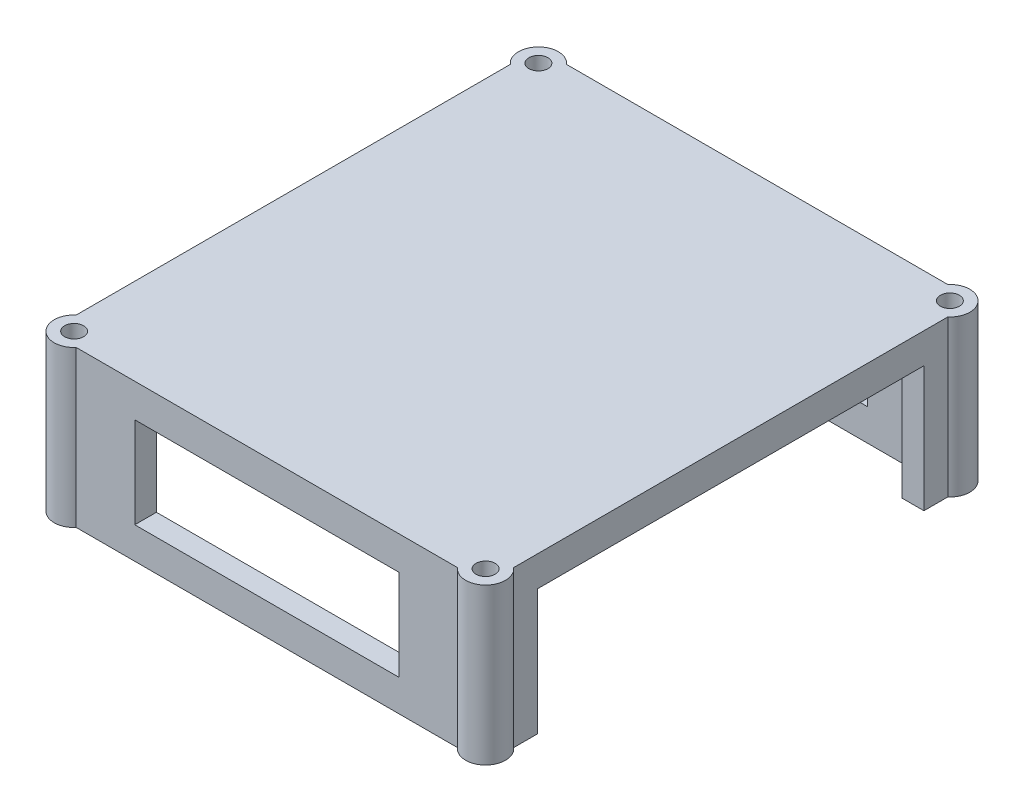
ISO-10303-21;
HEADER;
FILE_DESCRIPTION(('STEP AP214'),'2;1');
FILE_NAME('part.step','',(''),(''),'','','');
FILE_SCHEMA(('AUTOMOTIVE_DESIGN { 1 0 10303 214 1 1 1 1 }'));
ENDSEC;
DATA;
#1=APPLICATION_CONTEXT('core data for automotive mechanical design processes');
#2=APPLICATION_PROTOCOL_DEFINITION('international standard','automotive_design',2000,#1);
#3=PRODUCT_CONTEXT('',#1,'mechanical');
#4=PRODUCT('Part','Part','',(#3));
#5=PRODUCT_RELATED_PRODUCT_CATEGORY('part','',(#4));
#6=PRODUCT_DEFINITION_FORMATION('','',#4);
#7=PRODUCT_DEFINITION_CONTEXT('part definition',#1,'design');
#8=PRODUCT_DEFINITION('design','',#6,#7);
#9=PRODUCT_DEFINITION_SHAPE('','',#8);
#10=(LENGTH_UNIT() NAMED_UNIT(*) SI_UNIT(.MILLI.,.METRE.));
#11=(NAMED_UNIT(*) PLANE_ANGLE_UNIT() SI_UNIT($,.RADIAN.));
#12=(NAMED_UNIT(*) SI_UNIT($,.STERADIAN.) SOLID_ANGLE_UNIT());
#13=UNCERTAINTY_MEASURE_WITH_UNIT(LENGTH_MEASURE(1.E-05),#10,'distance_accuracy_value','');
#14=(GEOMETRIC_REPRESENTATION_CONTEXT(3) GLOBAL_UNCERTAINTY_ASSIGNED_CONTEXT((#13)) GLOBAL_UNIT_ASSIGNED_CONTEXT((#10,
#11,#12)) REPRESENTATION_CONTEXT('',''));
#15=CARTESIAN_POINT('',(0.,0.,0.));
#16=DIRECTION('',(0.,0.,1.));
#17=DIRECTION('',(1.,0.,0.));
#18=AXIS2_PLACEMENT_3D('',#15,#16,#17);
#19=CARTESIAN_POINT('',(0.,0.,0.));
#20=DIRECTION('',(0.,-1.,0.));
#21=DIRECTION('',(0.,0.,-1.));
#22=AXIS2_PLACEMENT_3D('',#19,#20,#21);
#23=PLANE('',#22);
#24=DIRECTION('',(-1.,0.,0.));
#25=VECTOR('',#24,1.);
#26=CARTESIAN_POINT('',(0.,0.,-143.764));
#27=LINE('',#26,#25);
#28=CARTESIAN_POINT('',(120.031358673363,0.,-143.764));
#29=VERTEX_POINT('',#28);
#30=CARTESIAN_POINT('',(8.23864132663731,0.,-143.764));
#31=VERTEX_POINT('',#30);
#32=EDGE_CURVE('E243',#29,#31,#27,.T.);
#33=ORIENTED_EDGE('',*,*,#32,.F.);
#34=CARTESIAN_POINT('',(124.46,0.,-139.954));
#35=DIRECTION('',(0.,-1.,0.));
#36=DIRECTION('',(0.,0.,-1.));
#37=AXIS2_PLACEMENT_3D('',#34,#35,#36);
#38=CIRCLE('',#37,5.84200000000003);
#39=CARTESIAN_POINT('',(128.27,0.,-135.525358673363));
#40=VERTEX_POINT('',#39);
#41=EDGE_CURVE('E246',#29,#40,#38,.T.);
#42=ORIENTED_EDGE('',*,*,#41,.T.);
#43=DIRECTION('',(0.,0.,-1.));
#44=VECTOR('',#43,1.);
#45=CARTESIAN_POINT('',(128.27,0.,0.));
#46=LINE('',#45,#44);
#47=CARTESIAN_POINT('',(128.27,0.,-128.524));
#48=VERTEX_POINT('',#47);
#49=EDGE_CURVE('E47',#48,#40,#46,.T.);
#50=ORIENTED_EDGE('',*,*,#49,.F.);
#51=DIRECTION('',(-1.,0.,0.));
#52=VECTOR('',#51,1.);
#53=CARTESIAN_POINT('',(0.,0.,-128.524));
#54=LINE('',#53,#52);
#55=CARTESIAN_POINT('',(121.92,0.,-128.524));
#56=VERTEX_POINT('',#55);
#57=EDGE_CURVE('E361',#48,#56,#54,.T.);
#58=ORIENTED_EDGE('',*,*,#57,.T.);
#59=DIRECTION('',(0.,0.,1.));
#60=VECTOR('',#59,1.);
#61=CARTESIAN_POINT('',(121.92,0.,-6.35));
#62=LINE('',#61,#60);
#63=CARTESIAN_POINT('',(121.92,0.,-134.693071944989));
#64=VERTEX_POINT('',#63);
#65=EDGE_CURVE('E447',#64,#56,#62,.T.);
#66=ORIENTED_EDGE('',*,*,#65,.F.);
#67=CARTESIAN_POINT('',(119.199071944989,0.,-137.414));
#68=VERTEX_POINT('',#67);
#69=EDGE_CURVE('E263',#64,#68,#38,.T.);
#70=ORIENTED_EDGE('',*,*,#69,.T.);
#71=DIRECTION('',(1.,0.,0.));
#72=VECTOR('',#71,1.);
#73=CARTESIAN_POINT('',(6.35000000000002,0.,-137.414));
#74=LINE('',#73,#72);
#75=CARTESIAN_POINT('',(9.07092805501082,0.,-137.414));
#76=VERTEX_POINT('',#75);
#77=EDGE_CURVE('E444',#76,#68,#74,.T.);
#78=ORIENTED_EDGE('',*,*,#77,.F.);
#79=CARTESIAN_POINT('',(3.81,0.,-139.954));
#80=DIRECTION('',(0.,-1.,0.));
#81=DIRECTION('',(0.,0.,-1.));
#82=AXIS2_PLACEMENT_3D('',#79,#80,#81);
#83=CIRCLE('',#82,5.84199999999999);
#84=CARTESIAN_POINT('',(6.35000000000002,0.,-134.693071944989));
#85=VERTEX_POINT('',#84);
#86=EDGE_CURVE('E278',#76,#85,#83,.T.);
#87=ORIENTED_EDGE('',*,*,#86,.T.);
#88=DIRECTION('',(0.,0.,-1.));
#89=VECTOR('',#88,1.);
#90=CARTESIAN_POINT('',(6.35,0.,-6.35));
#91=LINE('',#90,#89);
#92=CARTESIAN_POINT('',(6.35000000000001,0.,-128.524));
#93=VERTEX_POINT('',#92);
#94=EDGE_CURVE('E431',#93,#85,#91,.T.);
#95=ORIENTED_EDGE('',*,*,#94,.F.);
#96=CARTESIAN_POINT('',(0.,0.,-128.524));
#97=VERTEX_POINT('',#96);
#98=EDGE_CURVE('E365',#93,#97,#54,.T.);
#99=ORIENTED_EDGE('',*,*,#98,.T.);
#100=DIRECTION('',(0.,0.,1.));
#101=VECTOR('',#100,1.);
#102=CARTESIAN_POINT('',(0.,0.,0.));
#103=LINE('',#102,#101);
#104=CARTESIAN_POINT('',(0.,0.,-135.525358673363));
#105=VERTEX_POINT('',#104);
#106=EDGE_CURVE('E459',#105,#97,#103,.T.);
#107=ORIENTED_EDGE('',*,*,#106,.F.);
#108=EDGE_CURVE('E249',#105,#31,#83,.T.);
#109=ORIENTED_EDGE('',*,*,#108,.T.);
#110=EDGE_LOOP('',(#33,#42,#50,#58,#66,#70,#78,#87,#95,#99,#107,#109));
#111=FACE_BOUND('',#110,.T.);
#112=CARTESIAN_POINT('',(3.81,0.,-139.954));
#113=DIRECTION('',(0.,-1.,0.));
#114=DIRECTION('',(0.,0.,-1.));
#115=AXIS2_PLACEMENT_3D('',#112,#113,#114);
#116=CIRCLE('',#115,2.794);
#117=CARTESIAN_POINT('',(3.81,0.,-142.748));
#118=VERTEX_POINT('',#117);
#119=EDGE_CURVE('E327',#118,#118,#116,.T.);
#120=ORIENTED_EDGE('',*,*,#119,.F.);
#121=EDGE_LOOP('',(#120));
#122=FACE_BOUND('',#121,.T.);
#123=CARTESIAN_POINT('',(124.46,0.,-139.954));
#124=DIRECTION('',(0.,-1.,0.));
#125=DIRECTION('',(0.,0.,-1.));
#126=AXIS2_PLACEMENT_3D('',#123,#124,#125);
#127=CIRCLE('',#126,2.79400000000001);
#128=CARTESIAN_POINT('',(124.46,0.,-142.748));
#129=VERTEX_POINT('',#128);
#130=EDGE_CURVE('E323',#129,#129,#127,.T.);
#131=ORIENTED_EDGE('',*,*,#130,.F.);
#132=EDGE_LOOP('',(#131));
#133=FACE_BOUND('',#132,.T.);
#134=ADVANCED_FACE('F32',(#111,#122,#133),#23,.T.);
#135=CARTESIAN_POINT('',(0.,45.72,0.));
#136=DIRECTION('',(1.,0.,0.));
#137=DIRECTION('',(0.,0.,-1.));
#138=AXIS2_PLACEMENT_3D('',#135,#136,#137);
#139=PLANE('',#138);
#140=DIRECTION('',(0.,0.,1.));
#141=VECTOR('',#140,1.);
#142=CARTESIAN_POINT('',(0.,45.72,0.));
#143=LINE('',#142,#141);
#144=CARTESIAN_POINT('',(0.,45.72,-135.525358673363));
#145=VERTEX_POINT('',#144);
#146=CARTESIAN_POINT('',(0.,45.72,-8.23864132663733));
#147=VERTEX_POINT('',#146);
#148=EDGE_CURVE('E251',#145,#147,#143,.T.);
#149=ORIENTED_EDGE('',*,*,#148,.F.);
#150=DIRECTION('',(0.,-1.,0.));
#151=VECTOR('',#150,1.);
#152=CARTESIAN_POINT('',(0.,45.72,-135.525358673363));
#153=LINE('',#152,#151);
#154=EDGE_CURVE('E286',#145,#105,#153,.T.);
#155=ORIENTED_EDGE('',*,*,#154,.T.);
#156=ORIENTED_EDGE('',*,*,#106,.T.);
#157=DIRECTION('',(0.,-1.,0.));
#158=VECTOR('',#157,1.);
#159=CARTESIAN_POINT('',(0.,45.72,-128.524));
#160=LINE('',#159,#158);
#161=CARTESIAN_POINT('',(0.,36.83,-128.524));
#162=VERTEX_POINT('',#161);
#163=EDGE_CURVE('E367',#162,#97,#160,.T.);
#164=ORIENTED_EDGE('',*,*,#163,.F.);
#165=DIRECTION('',(0.,0.,-1.));
#166=VECTOR('',#165,1.);
#167=CARTESIAN_POINT('',(0.,36.83,0.));
#168=LINE('',#167,#166);
#169=CARTESIAN_POINT('',(0.,36.83,-15.24));
#170=VERTEX_POINT('',#169);
#171=EDGE_CURVE('E372',#170,#162,#168,.T.);
#172=ORIENTED_EDGE('',*,*,#171,.F.);
#173=DIRECTION('',(0.,-1.,0.));
#174=VECTOR('',#173,1.);
#175=CARTESIAN_POINT('',(0.,45.72,-15.24));
#176=LINE('',#175,#174);
#177=CARTESIAN_POINT('',(0.,0.,-15.24));
#178=VERTEX_POINT('',#177);
#179=EDGE_CURVE('E380',#170,#178,#176,.T.);
#180=ORIENTED_EDGE('',*,*,#179,.T.);
#181=CARTESIAN_POINT('',(0.,0.,-8.23864132663733));
#182=VERTEX_POINT('',#181);
#183=EDGE_CURVE('E441',#178,#182,#103,.T.);
#184=ORIENTED_EDGE('',*,*,#183,.T.);
#185=DIRECTION('',(0.,-1.,0.));
#186=VECTOR('',#185,1.);
#187=CARTESIAN_POINT('',(0.,45.72,-8.23864132663733));
#188=LINE('',#187,#186);
#189=EDGE_CURVE('E320',#182,#147,#188,.F.);
#190=ORIENTED_EDGE('',*,*,#189,.T.);
#191=EDGE_LOOP('',(#149,#155,#156,#164,#172,#180,#184,#190));
#192=FACE_BOUND('',#191,.T.);
#193=ADVANCED_FACE('F34',(#192),#139,.F.);
#194=CARTESIAN_POINT('',(0.,45.72,0.));
#195=DIRECTION('',(0.,0.,-1.));
#196=DIRECTION('',(-1.,0.,0.));
#197=AXIS2_PLACEMENT_3D('',#194,#195,#196);
#198=PLANE('',#197);
#199=DIRECTION('',(1.,0.,0.));
#200=VECTOR('',#199,1.);
#201=CARTESIAN_POINT('',(0.,35.941,0.));
#202=LINE('',#201,#200);
#203=CARTESIAN_POINT('',(25.4,35.941,0.));
#204=VERTEX_POINT('',#203);
#205=CARTESIAN_POINT('',(102.87,35.941,0.));
#206=VERTEX_POINT('',#205);
#207=EDGE_CURVE('E422',#204,#206,#202,.T.);
#208=ORIENTED_EDGE('',*,*,#207,.T.);
#209=DIRECTION('',(0.,-1.,0.));
#210=VECTOR('',#209,1.);
#211=CARTESIAN_POINT('',(102.87,45.72,0.));
#212=LINE('',#211,#210);
#213=CARTESIAN_POINT('',(102.87,9.271,0.));
#214=VERTEX_POINT('',#213);
#215=EDGE_CURVE('E428',#206,#214,#212,.T.);
#216=ORIENTED_EDGE('',*,*,#215,.T.);
#217=DIRECTION('',(-1.,0.,0.));
#218=VECTOR('',#217,1.);
#219=CARTESIAN_POINT('',(0.,9.271,0.));
#220=LINE('',#219,#218);
#221=CARTESIAN_POINT('',(25.4,9.271,0.));
#222=VERTEX_POINT('',#221);
#223=EDGE_CURVE('E410',#214,#222,#220,.T.);
#224=ORIENTED_EDGE('',*,*,#223,.T.);
#225=DIRECTION('',(0.,1.,0.));
#226=VECTOR('',#225,1.);
#227=CARTESIAN_POINT('',(25.4,45.72,0.));
#228=LINE('',#227,#226);
#229=EDGE_CURVE('E416',#222,#204,#228,.T.);
#230=ORIENTED_EDGE('',*,*,#229,.T.);
#231=EDGE_LOOP('',(#208,#216,#224,#230));
#232=FACE_BOUND('',#231,.T.);
#233=DIRECTION('',(1.,0.,0.));
#234=VECTOR('',#233,1.);
#235=CARTESIAN_POINT('',(0.,0.,0.));
#236=LINE('',#235,#234);
#237=CARTESIAN_POINT('',(8.23864132663733,0.,0.));
#238=VERTEX_POINT('',#237);
#239=CARTESIAN_POINT('',(120.031358673363,0.,0.));
#240=VERTEX_POINT('',#239);
#241=EDGE_CURVE('E461',#238,#240,#236,.T.);
#242=ORIENTED_EDGE('',*,*,#241,.T.);
#243=DIRECTION('',(0.,-1.,0.));
#244=VECTOR('',#243,1.);
#245=CARTESIAN_POINT('',(120.031358673363,45.72,0.));
#246=LINE('',#245,#244);
#247=CARTESIAN_POINT('',(120.031358673363,45.72,0.));
#248=VERTEX_POINT('',#247);
#249=EDGE_CURVE('E303',#240,#248,#246,.F.);
#250=ORIENTED_EDGE('',*,*,#249,.T.);
#251=DIRECTION('',(1.,0.,0.));
#252=VECTOR('',#251,1.);
#253=CARTESIAN_POINT('',(0.,45.72,0.));
#254=LINE('',#253,#252);
#255=CARTESIAN_POINT('',(8.23864132663733,45.72,0.));
#256=VERTEX_POINT('',#255);
#257=EDGE_CURVE('E451',#256,#248,#254,.T.);
#258=ORIENTED_EDGE('',*,*,#257,.F.);
#259=DIRECTION('',(0.,-1.,0.));
#260=VECTOR('',#259,1.);
#261=CARTESIAN_POINT('',(8.23864132663733,45.72,0.));
#262=LINE('',#261,#260);
#263=EDGE_CURVE('E317',#256,#238,#262,.T.);
#264=ORIENTED_EDGE('',*,*,#263,.T.);
#265=EDGE_LOOP('',(#242,#250,#258,#264));
#266=FACE_BOUND('',#265,.T.);
#267=ADVANCED_FACE('F584',(#232,#266),#198,.F.);
#268=CARTESIAN_POINT('',(128.27,45.72,0.));
#269=DIRECTION('',(-1.,0.,0.));
#270=DIRECTION('',(0.,0.,1.));
#271=AXIS2_PLACEMENT_3D('',#268,#269,#270);
#272=PLANE('',#271);
#273=ORIENTED_EDGE('',*,*,#49,.T.);
#274=DIRECTION('',(0.,-1.,0.));
#275=VECTOR('',#274,1.);
#276=CARTESIAN_POINT('',(128.27,45.72,-135.525358673363));
#277=LINE('',#276,#275);
#278=CARTESIAN_POINT('',(128.27,45.72,-135.525358673363));
#279=VERTEX_POINT('',#278);
#280=EDGE_CURVE('E259',#40,#279,#277,.F.);
#281=ORIENTED_EDGE('',*,*,#280,.T.);
#282=DIRECTION('',(0.,0.,-1.));
#283=VECTOR('',#282,1.);
#284=CARTESIAN_POINT('',(128.27,45.72,0.));
#285=LINE('',#284,#283);
#286=CARTESIAN_POINT('',(128.27,45.72,-8.23864132663734));
#287=VERTEX_POINT('',#286);
#288=EDGE_CURVE('E454',#287,#279,#285,.T.);
#289=ORIENTED_EDGE('',*,*,#288,.F.);
#290=DIRECTION('',(0.,-1.,0.));
#291=VECTOR('',#290,1.);
#292=CARTESIAN_POINT('',(128.27,45.72,-8.23864132663734));
#293=LINE('',#292,#291);
#294=CARTESIAN_POINT('',(128.27,0.,-8.23864132663734));
#295=VERTEX_POINT('',#294);
#296=EDGE_CURVE('E300',#287,#295,#293,.T.);
#297=ORIENTED_EDGE('',*,*,#296,.T.);
#298=CARTESIAN_POINT('',(128.27,0.,-15.24));
#299=VERTEX_POINT('',#298);
#300=EDGE_CURVE('E252',#295,#299,#46,.T.);
#301=ORIENTED_EDGE('',*,*,#300,.T.);
#302=DIRECTION('',(0.,-1.,0.));
#303=VECTOR('',#302,1.);
#304=CARTESIAN_POINT('',(128.27,36.83,-15.24));
#305=LINE('',#304,#303);
#306=CARTESIAN_POINT('',(128.27,36.83,-15.24));
#307=VERTEX_POINT('',#306);
#308=EDGE_CURVE('E352',#307,#299,#305,.T.);
#309=ORIENTED_EDGE('',*,*,#308,.F.);
#310=DIRECTION('',(0.,0.,-1.));
#311=VECTOR('',#310,1.);
#312=CARTESIAN_POINT('',(128.27,36.83,-15.24));
#313=LINE('',#312,#311);
#314=CARTESIAN_POINT('',(128.27,36.83,-128.524));
#315=VERTEX_POINT('',#314);
#316=EDGE_CURVE('E349',#307,#315,#313,.T.);
#317=ORIENTED_EDGE('',*,*,#316,.T.);
#318=DIRECTION('',(0.,-1.,0.));
#319=VECTOR('',#318,1.);
#320=CARTESIAN_POINT('',(128.27,36.83,-128.524));
#321=LINE('',#320,#319);
#322=EDGE_CURVE('E345',#315,#48,#321,.T.);
#323=ORIENTED_EDGE('',*,*,#322,.T.);
#324=EDGE_LOOP('',(#273,#281,#289,#297,#301,#309,#317,#323));
#325=FACE_BOUND('',#324,.T.);
#326=ADVANCED_FACE('F598',(#325),#272,.F.);
#327=CARTESIAN_POINT('',(0.,45.72,-143.764));
#328=DIRECTION('',(0.,0.,1.));
#329=DIRECTION('',(1.,0.,0.));
#330=AXIS2_PLACEMENT_3D('',#327,#328,#329);
#331=PLANE('',#330);
#332=DIRECTION('',(-1.,0.,0.));
#333=VECTOR('',#332,1.);
#334=CARTESIAN_POINT('',(102.87,9.271,-143.764));
#335=LINE('',#334,#333);
#336=CARTESIAN_POINT('',(102.87,9.271,-143.764));
#337=VERTEX_POINT('',#336);
#338=CARTESIAN_POINT('',(25.4,9.271,-143.764));
#339=VERTEX_POINT('',#338);
#340=EDGE_CURVE('E385',#337,#339,#335,.T.);
#341=ORIENTED_EDGE('',*,*,#340,.F.);
#342=DIRECTION('',(0.,-1.,0.));
#343=VECTOR('',#342,1.);
#344=CARTESIAN_POINT('',(102.87,35.941,-143.764));
#345=LINE('',#344,#343);
#346=CARTESIAN_POINT('',(102.87,35.941,-143.764));
#347=VERTEX_POINT('',#346);
#348=EDGE_CURVE('E383',#347,#337,#345,.T.);
#349=ORIENTED_EDGE('',*,*,#348,.F.);
#350=DIRECTION('',(1.,0.,0.));
#351=VECTOR('',#350,1.);
#352=CARTESIAN_POINT('',(102.87,35.941,-143.764));
#353=LINE('',#352,#351);
#354=CARTESIAN_POINT('',(25.4,35.941,-143.764));
#355=VERTEX_POINT('',#354);
#356=EDGE_CURVE('E391',#355,#347,#353,.T.);
#357=ORIENTED_EDGE('',*,*,#356,.F.);
#358=DIRECTION('',(0.,1.,0.));
#359=VECTOR('',#358,1.);
#360=CARTESIAN_POINT('',(25.4,35.941,-143.764));
#361=LINE('',#360,#359);
#362=EDGE_CURVE('E388',#339,#355,#361,.T.);
#363=ORIENTED_EDGE('',*,*,#362,.F.);
#364=EDGE_LOOP('',(#341,#349,#357,#363));
#365=FACE_BOUND('',#364,.T.);
#366=DIRECTION('',(-1.,0.,0.));
#367=VECTOR('',#366,1.);
#368=CARTESIAN_POINT('',(0.,45.72,-143.764));
#369=LINE('',#368,#367);
#370=CARTESIAN_POINT('',(120.031358673363,45.72,-143.764));
#371=VERTEX_POINT('',#370);
#372=CARTESIAN_POINT('',(8.23864132663731,45.72,-143.764));
#373=VERTEX_POINT('',#372);
#374=EDGE_CURVE('E55',#371,#373,#369,.T.);
#375=ORIENTED_EDGE('',*,*,#374,.F.);
#376=DIRECTION('',(0.,-1.,0.));
#377=VECTOR('',#376,1.);
#378=CARTESIAN_POINT('',(120.031358673363,45.72,-143.764));
#379=LINE('',#378,#377);
#380=EDGE_CURVE('E254',#371,#29,#379,.T.);
#381=ORIENTED_EDGE('',*,*,#380,.T.);
#382=ORIENTED_EDGE('',*,*,#32,.T.);
#383=DIRECTION('',(0.,-1.,0.));
#384=VECTOR('',#383,1.);
#385=CARTESIAN_POINT('',(8.23864132663731,45.72,-143.764));
#386=LINE('',#385,#384);
#387=EDGE_CURVE('E284',#31,#373,#386,.F.);
#388=ORIENTED_EDGE('',*,*,#387,.T.);
#389=EDGE_LOOP('',(#375,#381,#382,#388));
#390=FACE_BOUND('',#389,.T.);
#391=ADVANCED_FACE('F255',(#365,#390),#331,.F.);
#392=CARTESIAN_POINT('',(0.,45.72,0.));
#393=DIRECTION('',(0.,-1.,0.));
#394=DIRECTION('',(0.,0.,-1.));
#395=AXIS2_PLACEMENT_3D('',#392,#393,#394);
#396=PLANE('',#395);
#397=ORIENTED_EDGE('',*,*,#288,.T.);
#398=CARTESIAN_POINT('',(124.46,45.72,-139.954));
#399=DIRECTION('',(0.,-1.,0.));
#400=DIRECTION('',(0.,0.,-1.));
#401=AXIS2_PLACEMENT_3D('',#398,#399,#400);
#402=CIRCLE('',#401,5.84200000000003);
#403=EDGE_CURVE('E266',#371,#279,#402,.T.);
#404=ORIENTED_EDGE('',*,*,#403,.F.);
#405=ORIENTED_EDGE('',*,*,#374,.T.);
#406=CARTESIAN_POINT('',(3.81,45.72,-139.954));
#407=DIRECTION('',(0.,-1.,0.));
#408=DIRECTION('',(0.,0.,-1.));
#409=AXIS2_PLACEMENT_3D('',#406,#407,#408);
#410=CIRCLE('',#409,5.84199999999999);
#411=EDGE_CURVE('E274',#145,#373,#410,.T.);
#412=ORIENTED_EDGE('',*,*,#411,.F.);
#413=ORIENTED_EDGE('',*,*,#148,.T.);
#414=CARTESIAN_POINT('',(3.81,45.72,-3.81));
#415=DIRECTION('',(0.,-1.,0.));
#416=DIRECTION('',(0.,0.,-1.));
#417=AXIS2_PLACEMENT_3D('',#414,#415,#416);
#418=CIRCLE('',#417,5.842);
#419=EDGE_CURVE('E306',#256,#147,#418,.T.);
#420=ORIENTED_EDGE('',*,*,#419,.F.);
#421=ORIENTED_EDGE('',*,*,#257,.T.);
#422=CARTESIAN_POINT('',(124.46,45.72,-3.81));
#423=DIRECTION('',(0.,-1.,0.));
#424=DIRECTION('',(0.,0.,-1.));
#425=AXIS2_PLACEMENT_3D('',#422,#423,#424);
#426=CIRCLE('',#425,5.84200000000001);
#427=EDGE_CURVE('E289',#287,#248,#426,.T.);
#428=ORIENTED_EDGE('',*,*,#427,.F.);
#429=EDGE_LOOP('',(#397,#404,#405,#412,#413,#420,#421,#428));
#430=FACE_BOUND('',#429,.T.);
#431=CARTESIAN_POINT('',(3.81,45.72,-3.81));
#432=DIRECTION('',(0.,-1.,0.));
#433=DIRECTION('',(0.,0.,-1.));
#434=AXIS2_PLACEMENT_3D('',#431,#432,#433);
#435=CIRCLE('',#434,2.794);
#436=CARTESIAN_POINT('',(3.81,45.72,-6.604));
#437=VERTEX_POINT('',#436);
#438=EDGE_CURVE('E342',#437,#437,#435,.T.);
#439=ORIENTED_EDGE('',*,*,#438,.T.);
#440=EDGE_LOOP('',(#439));
#441=FACE_BOUND('',#440,.T.);
#442=CARTESIAN_POINT('',(124.46,45.72,-3.81));
#443=DIRECTION('',(0.,-1.,0.));
#444=DIRECTION('',(0.,0.,-1.));
#445=AXIS2_PLACEMENT_3D('',#442,#443,#444);
#446=CIRCLE('',#445,2.79400000000001);
#447=CARTESIAN_POINT('',(124.46,45.72,-6.60400000000001));
#448=VERTEX_POINT('',#447);
#449=EDGE_CURVE('E330',#448,#448,#446,.T.);
#450=ORIENTED_EDGE('',*,*,#449,.T.);
#451=EDGE_LOOP('',(#450));
#452=FACE_BOUND('',#451,.T.);
#453=CARTESIAN_POINT('',(3.81,45.72,-139.954));
#454=DIRECTION('',(0.,-1.,0.));
#455=DIRECTION('',(0.,0.,-1.));
#456=AXIS2_PLACEMENT_3D('',#453,#454,#455);
#457=CIRCLE('',#456,2.794);
#458=CARTESIAN_POINT('',(3.81,45.72,-142.748));
#459=VERTEX_POINT('',#458);
#460=EDGE_CURVE('E337',#459,#459,#457,.T.);
#461=ORIENTED_EDGE('',*,*,#460,.T.);
#462=EDGE_LOOP('',(#461));
#463=FACE_BOUND('',#462,.T.);
#464=CARTESIAN_POINT('',(124.46,45.72,-139.954));
#465=DIRECTION('',(0.,-1.,0.));
#466=DIRECTION('',(0.,0.,-1.));
#467=AXIS2_PLACEMENT_3D('',#464,#465,#466);
#468=CIRCLE('',#467,2.79400000000001);
#469=CARTESIAN_POINT('',(124.46,45.72,-142.748));
#470=VERTEX_POINT('',#469);
#471=EDGE_CURVE('E324',#470,#470,#468,.T.);
#472=ORIENTED_EDGE('',*,*,#471,.T.);
#473=EDGE_LOOP('',(#472));
#474=FACE_BOUND('',#473,.T.);
#475=ADVANCED_FACE('F588',(#430,#441,#452,#463,#474),#396,.F.);
#476=CARTESIAN_POINT('',(124.46,0.,-3.81));
#477=DIRECTION('',(0.,-1.,0.));
#478=DIRECTION('',(0.,0.,-1.));
#479=AXIS2_PLACEMENT_3D('',#476,#477,#478);
#480=CIRCLE('',#479,5.84200000000001);
#481=EDGE_CURVE('E293',#295,#240,#480,.T.);
#482=ORIENTED_EDGE('',*,*,#481,.T.);
#483=ORIENTED_EDGE('',*,*,#241,.F.);
#484=CARTESIAN_POINT('',(3.81,0.,-3.81));
#485=DIRECTION('',(0.,-1.,0.));
#486=DIRECTION('',(0.,0.,-1.));
#487=AXIS2_PLACEMENT_3D('',#484,#485,#486);
#488=CIRCLE('',#487,5.842);
#489=EDGE_CURVE('E305',#238,#182,#488,.T.);
#490=ORIENTED_EDGE('',*,*,#489,.T.);
#491=ORIENTED_EDGE('',*,*,#183,.F.);
#492=DIRECTION('',(-1.,0.,0.));
#493=VECTOR('',#492,1.);
#494=CARTESIAN_POINT('',(0.,0.,-15.24));
#495=LINE('',#494,#493);
#496=CARTESIAN_POINT('',(6.35,0.,-15.24));
#497=VERTEX_POINT('',#496);
#498=EDGE_CURVE('E377',#497,#178,#495,.T.);
#499=ORIENTED_EDGE('',*,*,#498,.F.);
#500=CARTESIAN_POINT('',(6.35,0.,-9.07092805501083));
#501=VERTEX_POINT('',#500);
#502=EDGE_CURVE('E442',#501,#497,#91,.T.);
#503=ORIENTED_EDGE('',*,*,#502,.F.);
#504=CARTESIAN_POINT('',(9.07092805501083,0.,-6.35));
#505=VERTEX_POINT('',#504);
#506=EDGE_CURVE('E310',#501,#505,#488,.T.);
#507=ORIENTED_EDGE('',*,*,#506,.T.);
#508=DIRECTION('',(-1.,0.,0.));
#509=VECTOR('',#508,1.);
#510=CARTESIAN_POINT('',(6.35,0.,-6.35));
#511=LINE('',#510,#509);
#512=CARTESIAN_POINT('',(119.199071944989,0.,-6.35));
#513=VERTEX_POINT('',#512);
#514=EDGE_CURVE('E435',#513,#505,#511,.T.);
#515=ORIENTED_EDGE('',*,*,#514,.F.);
#516=CARTESIAN_POINT('',(121.92,0.,-9.07092805501083));
#517=VERTEX_POINT('',#516);
#518=EDGE_CURVE('E288',#513,#517,#480,.T.);
#519=ORIENTED_EDGE('',*,*,#518,.T.);
#520=CARTESIAN_POINT('',(121.92,0.,-15.24));
#521=VERTEX_POINT('',#520);
#522=EDGE_CURVE('E446',#521,#517,#62,.T.);
#523=ORIENTED_EDGE('',*,*,#522,.F.);
#524=EDGE_CURVE('E374',#299,#521,#495,.T.);
#525=ORIENTED_EDGE('',*,*,#524,.F.);
#526=ORIENTED_EDGE('',*,*,#300,.F.);
#527=EDGE_LOOP('',(#482,#483,#490,#491,#499,#503,#507,#515,#519,#523,#525,#526));
#528=FACE_BOUND('',#527,.T.);
#529=CARTESIAN_POINT('',(124.46,0.,-3.81));
#530=DIRECTION('',(0.,-1.,0.));
#531=DIRECTION('',(0.,0.,-1.));
#532=AXIS2_PLACEMENT_3D('',#529,#530,#531);
#533=CIRCLE('',#532,2.79400000000001);
#534=CARTESIAN_POINT('',(124.46,0.,-6.60400000000001));
#535=VERTEX_POINT('',#534);
#536=EDGE_CURVE('E334',#535,#535,#533,.T.);
#537=ORIENTED_EDGE('',*,*,#536,.F.);
#538=EDGE_LOOP('',(#537));
#539=FACE_BOUND('',#538,.T.);
#540=CARTESIAN_POINT('',(3.81,0.,-3.81));
#541=DIRECTION('',(0.,-1.,0.));
#542=DIRECTION('',(0.,0.,-1.));
#543=AXIS2_PLACEMENT_3D('',#540,#541,#542);
#544=CIRCLE('',#543,2.794);
#545=CARTESIAN_POINT('',(3.81,0.,-6.604));
#546=VERTEX_POINT('',#545);
#547=EDGE_CURVE('E333',#546,#546,#544,.T.);
#548=ORIENTED_EDGE('',*,*,#547,.F.);
#549=EDGE_LOOP('',(#548));
#550=FACE_BOUND('',#549,.T.);
#551=ADVANCED_FACE('F547',(#528,#539,#550),#23,.T.);
#552=CARTESIAN_POINT('',(6.35,41.91,-6.35));
#553=DIRECTION('',(-1.,0.,0.));
#554=DIRECTION('',(0.,0.,1.));
#555=AXIS2_PLACEMENT_3D('',#552,#553,#554);
#556=PLANE('',#555);
#557=ORIENTED_EDGE('',*,*,#94,.T.);
#558=DIRECTION('',(0.,-1.,0.));
#559=VECTOR('',#558,1.);
#560=CARTESIAN_POINT('',(6.35000000000001,45.72,-134.693071944989));
#561=LINE('',#560,#559);
#562=CARTESIAN_POINT('',(6.35000000000001,41.91,-134.693071944989));
#563=VERTEX_POINT('',#562);
#564=EDGE_CURVE('E281',#85,#563,#561,.F.);
#565=ORIENTED_EDGE('',*,*,#564,.T.);
#566=DIRECTION('',(0.,0.,-1.));
#567=VECTOR('',#566,1.);
#568=CARTESIAN_POINT('',(6.35,41.91,-6.35));
#569=LINE('',#568,#567);
#570=CARTESIAN_POINT('',(6.35,41.91,-9.07092805501083));
#571=VERTEX_POINT('',#570);
#572=EDGE_CURVE('E432',#571,#563,#569,.T.);
#573=ORIENTED_EDGE('',*,*,#572,.F.);
#574=DIRECTION('',(0.,-1.,0.));
#575=VECTOR('',#574,1.);
#576=CARTESIAN_POINT('',(6.35,45.72,-9.07092805501083));
#577=LINE('',#576,#575);
#578=EDGE_CURVE('E315',#571,#501,#577,.T.);
#579=ORIENTED_EDGE('',*,*,#578,.T.);
#580=ORIENTED_EDGE('',*,*,#502,.T.);
#581=DIRECTION('',(0.,1.,0.));
#582=VECTOR('',#581,1.);
#583=CARTESIAN_POINT('',(6.35,41.91,-15.24));
#584=LINE('',#583,#582);
#585=CARTESIAN_POINT('',(6.35000000000001,36.83,-15.24));
#586=VERTEX_POINT('',#585);
#587=EDGE_CURVE('E376',#497,#586,#584,.T.);
#588=ORIENTED_EDGE('',*,*,#587,.T.);
#589=DIRECTION('',(0.,0.,1.));
#590=VECTOR('',#589,1.);
#591=CARTESIAN_POINT('',(6.35,36.83,-6.35));
#592=LINE('',#591,#590);
#593=CARTESIAN_POINT('',(6.35000000000001,36.83,-128.524));
#594=VERTEX_POINT('',#593);
#595=EDGE_CURVE('E370',#594,#586,#592,.T.);
#596=ORIENTED_EDGE('',*,*,#595,.F.);
#597=DIRECTION('',(0.,1.,0.));
#598=VECTOR('',#597,1.);
#599=CARTESIAN_POINT('',(6.35000000000001,41.91,-128.524));
#600=LINE('',#599,#598);
#601=EDGE_CURVE('E364',#93,#594,#600,.T.);
#602=ORIENTED_EDGE('',*,*,#601,.F.);
#603=EDGE_LOOP('',(#557,#565,#573,#579,#580,#588,#596,#602));
#604=FACE_BOUND('',#603,.T.);
#605=ADVANCED_FACE('F529',(#604),#556,.F.);
#606=CARTESIAN_POINT('',(6.35,41.91,-6.35));
#607=DIRECTION('',(0.,0.,1.));
#608=DIRECTION('',(1.,0.,0.));
#609=AXIS2_PLACEMENT_3D('',#606,#607,#608);
#610=PLANE('',#609);
#611=DIRECTION('',(1.,0.,0.));
#612=VECTOR('',#611,1.);
#613=CARTESIAN_POINT('',(6.35,9.271,-6.35));
#614=LINE('',#613,#612);
#615=CARTESIAN_POINT('',(25.4,9.271,-6.35));
#616=VERTEX_POINT('',#615);
#617=CARTESIAN_POINT('',(102.87,9.271,-6.35));
#618=VERTEX_POINT('',#617);
#619=EDGE_CURVE('E407',#616,#618,#614,.T.);
#620=ORIENTED_EDGE('',*,*,#619,.T.);
#621=DIRECTION('',(0.,1.,0.));
#622=VECTOR('',#621,1.);
#623=CARTESIAN_POINT('',(102.87,41.91,-6.35));
#624=LINE('',#623,#622);
#625=CARTESIAN_POINT('',(102.87,35.941,-6.35));
#626=VERTEX_POINT('',#625);
#627=EDGE_CURVE('E425',#618,#626,#624,.T.);
#628=ORIENTED_EDGE('',*,*,#627,.T.);
#629=DIRECTION('',(-1.,0.,0.));
#630=VECTOR('',#629,1.);
#631=CARTESIAN_POINT('',(6.35,35.941,-6.35));
#632=LINE('',#631,#630);
#633=CARTESIAN_POINT('',(25.4,35.941,-6.35));
#634=VERTEX_POINT('',#633);
#635=EDGE_CURVE('E419',#626,#634,#632,.T.);
#636=ORIENTED_EDGE('',*,*,#635,.T.);
#637=DIRECTION('',(0.,-1.,0.));
#638=VECTOR('',#637,1.);
#639=CARTESIAN_POINT('',(25.4,41.91,-6.35));
#640=LINE('',#639,#638);
#641=EDGE_CURVE('E413',#634,#616,#640,.T.);
#642=ORIENTED_EDGE('',*,*,#641,.T.);
#643=EDGE_LOOP('',(#620,#628,#636,#642));
#644=FACE_BOUND('',#643,.T.);
#645=DIRECTION('',(-1.,0.,0.));
#646=VECTOR('',#645,1.);
#647=CARTESIAN_POINT('',(6.35,41.91,-6.35));
#648=LINE('',#647,#646);
#649=CARTESIAN_POINT('',(119.199071944989,41.91,-6.35));
#650=VERTEX_POINT('',#649);
#651=CARTESIAN_POINT('',(9.07092805501083,41.91,-6.35));
#652=VERTEX_POINT('',#651);
#653=EDGE_CURVE('E439',#650,#652,#648,.T.);
#654=ORIENTED_EDGE('',*,*,#653,.F.);
#655=DIRECTION('',(0.,-1.,0.));
#656=VECTOR('',#655,1.);
#657=CARTESIAN_POINT('',(119.199071944989,45.72,-6.35));
#658=LINE('',#657,#656);
#659=EDGE_CURVE('E298',#650,#513,#658,.T.);
#660=ORIENTED_EDGE('',*,*,#659,.T.);
#661=ORIENTED_EDGE('',*,*,#514,.T.);
#662=DIRECTION('',(0.,-1.,0.));
#663=VECTOR('',#662,1.);
#664=CARTESIAN_POINT('',(9.07092805501083,45.72,-6.35));
#665=LINE('',#664,#663);
#666=EDGE_CURVE('E309',#505,#652,#665,.F.);
#667=ORIENTED_EDGE('',*,*,#666,.T.);
#668=EDGE_LOOP('',(#654,#660,#661,#667));
#669=FACE_BOUND('',#668,.T.);
#670=ADVANCED_FACE('F521',(#644,#669),#610,.F.);
#671=CARTESIAN_POINT('',(121.92,41.91,-6.35));
#672=DIRECTION('',(1.,0.,0.));
#673=DIRECTION('',(0.,0.,-1.));
#674=AXIS2_PLACEMENT_3D('',#671,#672,#673);
#675=PLANE('',#674);
#676=DIRECTION('',(0.,0.,1.));
#677=VECTOR('',#676,1.);
#678=CARTESIAN_POINT('',(121.92,41.91,-6.35));
#679=LINE('',#678,#677);
#680=CARTESIAN_POINT('',(121.92,41.91,-134.693071944989));
#681=VERTEX_POINT('',#680);
#682=CARTESIAN_POINT('',(121.92,41.91,-9.07092805501083));
#683=VERTEX_POINT('',#682);
#684=EDGE_CURVE('E437',#681,#683,#679,.T.);
#685=ORIENTED_EDGE('',*,*,#684,.F.);
#686=DIRECTION('',(0.,-1.,0.));
#687=VECTOR('',#686,1.);
#688=CARTESIAN_POINT('',(121.92,45.72,-134.693071944989));
#689=LINE('',#688,#687);
#690=EDGE_CURVE('E260',#681,#64,#689,.T.);
#691=ORIENTED_EDGE('',*,*,#690,.T.);
#692=ORIENTED_EDGE('',*,*,#65,.T.);
#693=DIRECTION('',(0.,-1.,0.));
#694=VECTOR('',#693,1.);
#695=CARTESIAN_POINT('',(121.92,41.91,-128.524));
#696=LINE('',#695,#694);
#697=CARTESIAN_POINT('',(121.92,36.83,-128.524));
#698=VERTEX_POINT('',#697);
#699=EDGE_CURVE('E475',#698,#56,#696,.T.);
#700=ORIENTED_EDGE('',*,*,#699,.F.);
#701=DIRECTION('',(0.,0.,-1.));
#702=VECTOR('',#701,1.);
#703=CARTESIAN_POINT('',(121.92,36.83,-6.35));
#704=LINE('',#703,#702);
#705=CARTESIAN_POINT('',(121.92,36.83,-15.24));
#706=VERTEX_POINT('',#705);
#707=EDGE_CURVE('E478',#706,#698,#704,.T.);
#708=ORIENTED_EDGE('',*,*,#707,.F.);
#709=DIRECTION('',(0.,-1.,0.));
#710=VECTOR('',#709,1.);
#711=CARTESIAN_POINT('',(121.92,41.91,-15.24));
#712=LINE('',#711,#710);
#713=EDGE_CURVE('E481',#706,#521,#712,.T.);
#714=ORIENTED_EDGE('',*,*,#713,.T.);
#715=ORIENTED_EDGE('',*,*,#522,.T.);
#716=DIRECTION('',(0.,-1.,0.));
#717=VECTOR('',#716,1.);
#718=CARTESIAN_POINT('',(121.92,45.72,-9.07092805501083));
#719=LINE('',#718,#717);
#720=EDGE_CURVE('E292',#517,#683,#719,.F.);
#721=ORIENTED_EDGE('',*,*,#720,.T.);
#722=EDGE_LOOP('',(#685,#691,#692,#700,#708,#714,#715,#721));
#723=FACE_BOUND('',#722,.T.);
#724=ADVANCED_FACE('F510',(#723),#675,.F.);
#725=CARTESIAN_POINT('',(6.35000000000002,41.91,-137.414));
#726=DIRECTION('',(0.,0.,-1.));
#727=DIRECTION('',(-1.,0.,0.));
#728=AXIS2_PLACEMENT_3D('',#725,#726,#727);
#729=PLANE('',#728);
#730=DIRECTION('',(1.,0.,0.));
#731=VECTOR('',#730,1.);
#732=CARTESIAN_POINT('',(6.35000000000001,35.941,-137.414));
#733=LINE('',#732,#731);
#734=CARTESIAN_POINT('',(25.4,35.941,-137.414));
#735=VERTEX_POINT('',#734);
#736=CARTESIAN_POINT('',(102.87,35.941,-137.414));
#737=VERTEX_POINT('',#736);
#738=EDGE_CURVE('E469',#735,#737,#733,.T.);
#739=ORIENTED_EDGE('',*,*,#738,.T.);
#740=DIRECTION('',(0.,-1.,0.));
#741=VECTOR('',#740,1.);
#742=CARTESIAN_POINT('',(102.87,41.91,-137.414));
#743=LINE('',#742,#741);
#744=CARTESIAN_POINT('',(102.87,9.271,-137.414));
#745=VERTEX_POINT('',#744);
#746=EDGE_CURVE('E472',#737,#745,#743,.T.);
#747=ORIENTED_EDGE('',*,*,#746,.T.);
#748=DIRECTION('',(-1.,0.,0.));
#749=VECTOR('',#748,1.);
#750=CARTESIAN_POINT('',(6.35000000000001,9.271,-137.414));
#751=LINE('',#750,#749);
#752=CARTESIAN_POINT('',(25.4,9.271,-137.414));
#753=VERTEX_POINT('',#752);
#754=EDGE_CURVE('E458',#745,#753,#751,.T.);
#755=ORIENTED_EDGE('',*,*,#754,.T.);
#756=DIRECTION('',(0.,1.,0.));
#757=VECTOR('',#756,1.);
#758=CARTESIAN_POINT('',(25.4,41.91,-137.414));
#759=LINE('',#758,#757);
#760=EDGE_CURVE('E466',#753,#735,#759,.T.);
#761=ORIENTED_EDGE('',*,*,#760,.T.);
#762=EDGE_LOOP('',(#739,#747,#755,#761));
#763=FACE_BOUND('',#762,.T.);
#764=ORIENTED_EDGE('',*,*,#77,.T.);
#765=DIRECTION('',(0.,-1.,0.));
#766=VECTOR('',#765,1.);
#767=CARTESIAN_POINT('',(119.199071944989,45.72,-137.414));
#768=LINE('',#767,#766);
#769=CARTESIAN_POINT('',(119.199071944989,41.91,-137.414));
#770=VERTEX_POINT('',#769);
#771=EDGE_CURVE('E269',#68,#770,#768,.F.);
#772=ORIENTED_EDGE('',*,*,#771,.T.);
#773=DIRECTION('',(1.,0.,0.));
#774=VECTOR('',#773,1.);
#775=CARTESIAN_POINT('',(6.35000000000002,41.91,-137.414));
#776=LINE('',#775,#774);
#777=CARTESIAN_POINT('',(9.07092805501082,41.91,-137.414));
#778=VERTEX_POINT('',#777);
#779=EDGE_CURVE('E434',#778,#770,#776,.T.);
#780=ORIENTED_EDGE('',*,*,#779,.F.);
#781=DIRECTION('',(0.,-1.,0.));
#782=VECTOR('',#781,1.);
#783=CARTESIAN_POINT('',(9.07092805501082,45.72,-137.414));
#784=LINE('',#783,#782);
#785=EDGE_CURVE('E277',#778,#76,#784,.T.);
#786=ORIENTED_EDGE('',*,*,#785,.T.);
#787=EDGE_LOOP('',(#764,#772,#780,#786));
#788=FACE_BOUND('',#787,.T.);
#789=ADVANCED_FACE('F501',(#763,#788),#729,.F.);
#790=CARTESIAN_POINT('',(0.,41.91,0.));
#791=DIRECTION('',(0.,-1.,0.));
#792=DIRECTION('',(0.,0.,-1.));
#793=AXIS2_PLACEMENT_3D('',#790,#791,#792);
#794=PLANE('',#793);
#795=CARTESIAN_POINT('',(124.46,41.91,-139.954));
#796=DIRECTION('',(0.,-1.,0.));
#797=DIRECTION('',(0.,0.,-1.));
#798=AXIS2_PLACEMENT_3D('',#795,#796,#797);
#799=CIRCLE('',#798,5.84200000000003);
#800=EDGE_CURVE('E11',#681,#770,#799,.T.);
#801=ORIENTED_EDGE('',*,*,#800,.F.);
#802=ORIENTED_EDGE('',*,*,#684,.T.);
#803=CARTESIAN_POINT('',(124.46,41.91,-3.81));
#804=DIRECTION('',(0.,-1.,0.));
#805=DIRECTION('',(0.,0.,-1.));
#806=AXIS2_PLACEMENT_3D('',#803,#804,#805);
#807=CIRCLE('',#806,5.84200000000001);
#808=EDGE_CURVE('E487',#650,#683,#807,.T.);
#809=ORIENTED_EDGE('',*,*,#808,.F.);
#810=ORIENTED_EDGE('',*,*,#653,.T.);
#811=CARTESIAN_POINT('',(3.81,41.91,-3.81));
#812=DIRECTION('',(0.,-1.,0.));
#813=DIRECTION('',(0.,0.,-1.));
#814=AXIS2_PLACEMENT_3D('',#811,#812,#813);
#815=CIRCLE('',#814,5.842);
#816=EDGE_CURVE('E484',#571,#652,#815,.T.);
#817=ORIENTED_EDGE('',*,*,#816,.F.);
#818=ORIENTED_EDGE('',*,*,#572,.T.);
#819=CARTESIAN_POINT('',(3.81,41.91,-139.954));
#820=DIRECTION('',(0.,-1.,0.));
#821=DIRECTION('',(0.,0.,-1.));
#822=AXIS2_PLACEMENT_3D('',#819,#820,#821);
#823=CIRCLE('',#822,5.84199999999999);
#824=EDGE_CURVE('E40',#778,#563,#823,.T.);
#825=ORIENTED_EDGE('',*,*,#824,.F.);
#826=ORIENTED_EDGE('',*,*,#779,.T.);
#827=EDGE_LOOP('',(#801,#802,#809,#810,#817,#818,#825,#826));
#828=FACE_BOUND('',#827,.T.);
#829=ADVANCED_FACE('F498',(#828),#794,.T.);
#830=CARTESIAN_POINT('',(102.87,9.271,46.99));
#831=DIRECTION('',(0.,-1.,0.));
#832=DIRECTION('',(1.,0.,0.));
#833=AXIS2_PLACEMENT_3D('',#830,#831,#832);
#834=PLANE('',#833);
#835=DIRECTION('',(0.,0.,-1.));
#836=VECTOR('',#835,1.);
#837=CARTESIAN_POINT('',(102.87,9.271,46.99));
#838=LINE('',#837,#836);
#839=EDGE_CURVE('E394',#745,#337,#838,.T.);
#840=ORIENTED_EDGE('',*,*,#839,.T.);
#841=ORIENTED_EDGE('',*,*,#340,.T.);
#842=DIRECTION('',(0.,0.,-1.));
#843=VECTOR('',#842,1.);
#844=CARTESIAN_POINT('',(25.4,9.271,46.99));
#845=LINE('',#844,#843);
#846=EDGE_CURVE('E402',#753,#339,#845,.T.);
#847=ORIENTED_EDGE('',*,*,#846,.F.);
#848=ORIENTED_EDGE('',*,*,#754,.F.);
#849=EDGE_LOOP('',(#840,#841,#847,#848));
#850=FACE_BOUND('',#849,.T.);
#851=ADVANCED_FACE('F612',(#850),#834,.F.);
#852=CARTESIAN_POINT('',(25.4,35.941,46.99));
#853=DIRECTION('',(-1.,0.,0.));
#854=DIRECTION('',(0.,-1.,0.));
#855=AXIS2_PLACEMENT_3D('',#852,#853,#854);
#856=PLANE('',#855);
#857=ORIENTED_EDGE('',*,*,#846,.T.);
#858=ORIENTED_EDGE('',*,*,#362,.T.);
#859=DIRECTION('',(0.,0.,-1.));
#860=VECTOR('',#859,1.);
#861=CARTESIAN_POINT('',(25.4,35.941,46.99));
#862=LINE('',#861,#860);
#863=EDGE_CURVE('E399',#735,#355,#862,.T.);
#864=ORIENTED_EDGE('',*,*,#863,.F.);
#865=ORIENTED_EDGE('',*,*,#760,.F.);
#866=EDGE_LOOP('',(#857,#858,#864,#865));
#867=FACE_BOUND('',#866,.T.);
#868=ADVANCED_FACE('F625',(#867),#856,.F.);
#869=CARTESIAN_POINT('',(102.87,35.941,46.99));
#870=DIRECTION('',(0.,1.,0.));
#871=DIRECTION('',(-1.,0.,0.));
#872=AXIS2_PLACEMENT_3D('',#869,#870,#871);
#873=PLANE('',#872);
#874=ORIENTED_EDGE('',*,*,#863,.T.);
#875=ORIENTED_EDGE('',*,*,#356,.T.);
#876=DIRECTION('',(0.,0.,-1.));
#877=VECTOR('',#876,1.);
#878=CARTESIAN_POINT('',(102.87,35.941,46.99));
#879=LINE('',#878,#877);
#880=EDGE_CURVE('E395',#737,#347,#879,.T.);
#881=ORIENTED_EDGE('',*,*,#880,.F.);
#882=ORIENTED_EDGE('',*,*,#738,.F.);
#883=EDGE_LOOP('',(#874,#875,#881,#882));
#884=FACE_BOUND('',#883,.T.);
#885=ADVANCED_FACE('F628',(#884),#873,.F.);
#886=CARTESIAN_POINT('',(102.87,35.941,46.99));
#887=DIRECTION('',(1.,0.,0.));
#888=DIRECTION('',(0.,0.,-1.));
#889=AXIS2_PLACEMENT_3D('',#886,#887,#888);
#890=PLANE('',#889);
#891=ORIENTED_EDGE('',*,*,#880,.T.);
#892=ORIENTED_EDGE('',*,*,#348,.T.);
#893=ORIENTED_EDGE('',*,*,#839,.F.);
#894=ORIENTED_EDGE('',*,*,#746,.F.);
#895=EDGE_LOOP('',(#891,#892,#893,#894));
#896=FACE_BOUND('',#895,.T.);
#897=ADVANCED_FACE('F617',(#896),#890,.F.);
#898=EDGE_CURVE('E397',#206,#626,#879,.T.);
#899=ORIENTED_EDGE('',*,*,#898,.T.);
#900=ORIENTED_EDGE('',*,*,#627,.F.);
#901=EDGE_CURVE('E404',#214,#618,#838,.T.);
#902=ORIENTED_EDGE('',*,*,#901,.F.);
#903=ORIENTED_EDGE('',*,*,#215,.F.);
#904=EDGE_LOOP('',(#899,#900,#902,#903));
#905=FACE_BOUND('',#904,.T.);
#906=ADVANCED_FACE('F613',(#905),#890,.F.);
#907=EDGE_CURVE('E398',#204,#634,#862,.T.);
#908=ORIENTED_EDGE('',*,*,#907,.T.);
#909=ORIENTED_EDGE('',*,*,#635,.F.);
#910=ORIENTED_EDGE('',*,*,#898,.F.);
#911=ORIENTED_EDGE('',*,*,#207,.F.);
#912=EDGE_LOOP('',(#908,#909,#910,#911));
#913=FACE_BOUND('',#912,.T.);
#914=ADVANCED_FACE('F616',(#913),#873,.F.);
#915=EDGE_CURVE('E401',#222,#616,#845,.T.);
#916=ORIENTED_EDGE('',*,*,#915,.T.);
#917=ORIENTED_EDGE('',*,*,#641,.F.);
#918=ORIENTED_EDGE('',*,*,#907,.F.);
#919=ORIENTED_EDGE('',*,*,#229,.F.);
#920=EDGE_LOOP('',(#916,#917,#918,#919));
#921=FACE_BOUND('',#920,.T.);
#922=ADVANCED_FACE('F621',(#921),#856,.F.);
#923=ORIENTED_EDGE('',*,*,#901,.T.);
#924=ORIENTED_EDGE('',*,*,#619,.F.);
#925=ORIENTED_EDGE('',*,*,#915,.F.);
#926=ORIENTED_EDGE('',*,*,#223,.F.);
#927=EDGE_LOOP('',(#923,#924,#925,#926));
#928=FACE_BOUND('',#927,.T.);
#929=ADVANCED_FACE('F578',(#928),#834,.F.);
#930=CARTESIAN_POINT('',(-62.484,36.83,-128.524));
#931=DIRECTION('',(0.,0.,1.));
#932=DIRECTION('',(1.,0.,0.));
#933=AXIS2_PLACEMENT_3D('',#930,#931,#932);
#934=PLANE('',#933);
#935=ORIENTED_EDGE('',*,*,#322,.F.);
#936=DIRECTION('',(1.,0.,0.));
#937=VECTOR('',#936,1.);
#938=CARTESIAN_POINT('',(-62.484,36.83,-128.524));
#939=LINE('',#938,#937);
#940=EDGE_CURVE('E355',#698,#315,#939,.T.);
#941=ORIENTED_EDGE('',*,*,#940,.F.);
#942=ORIENTED_EDGE('',*,*,#699,.T.);
#943=ORIENTED_EDGE('',*,*,#57,.F.);
#944=EDGE_LOOP('',(#935,#941,#942,#943));
#945=FACE_BOUND('',#944,.T.);
#946=ADVANCED_FACE('F539',(#945),#934,.T.);
#947=CARTESIAN_POINT('',(-62.484,36.83,-15.24));
#948=DIRECTION('',(0.,-1.,0.));
#949=DIRECTION('',(0.,0.,-1.));
#950=AXIS2_PLACEMENT_3D('',#947,#948,#949);
#951=PLANE('',#950);
#952=ORIENTED_EDGE('',*,*,#707,.T.);
#953=ORIENTED_EDGE('',*,*,#940,.T.);
#954=ORIENTED_EDGE('',*,*,#316,.F.);
#955=DIRECTION('',(1.,0.,0.));
#956=VECTOR('',#955,1.);
#957=CARTESIAN_POINT('',(-62.484,36.83,-15.24));
#958=LINE('',#957,#956);
#959=EDGE_CURVE('E356',#706,#307,#958,.T.);
#960=ORIENTED_EDGE('',*,*,#959,.F.);
#961=EDGE_LOOP('',(#952,#953,#954,#960));
#962=FACE_BOUND('',#961,.T.);
#963=ADVANCED_FACE('F543',(#962),#951,.T.);
#964=CARTESIAN_POINT('',(-62.484,36.83,-15.24));
#965=DIRECTION('',(0.,0.,1.));
#966=DIRECTION('',(0.,-1.,0.));
#967=AXIS2_PLACEMENT_3D('',#964,#965,#966);
#968=PLANE('',#967);
#969=ORIENTED_EDGE('',*,*,#524,.T.);
#970=ORIENTED_EDGE('',*,*,#713,.F.);
#971=ORIENTED_EDGE('',*,*,#959,.T.);
#972=ORIENTED_EDGE('',*,*,#308,.T.);
#973=EDGE_LOOP('',(#969,#970,#971,#972));
#974=FACE_BOUND('',#973,.T.);
#975=ADVANCED_FACE('F706',(#974),#968,.F.);
#976=EDGE_CURVE('E358',#170,#586,#958,.T.);
#977=ORIENTED_EDGE('',*,*,#976,.T.);
#978=ORIENTED_EDGE('',*,*,#587,.F.);
#979=ORIENTED_EDGE('',*,*,#498,.T.);
#980=ORIENTED_EDGE('',*,*,#179,.F.);
#981=EDGE_LOOP('',(#977,#978,#979,#980));
#982=FACE_BOUND('',#981,.T.);
#983=ADVANCED_FACE('F554',(#982),#968,.F.);
#984=ORIENTED_EDGE('',*,*,#171,.T.);
#985=EDGE_CURVE('E359',#162,#594,#939,.T.);
#986=ORIENTED_EDGE('',*,*,#985,.T.);
#987=ORIENTED_EDGE('',*,*,#595,.T.);
#988=ORIENTED_EDGE('',*,*,#976,.F.);
#989=EDGE_LOOP('',(#984,#986,#987,#988));
#990=FACE_BOUND('',#989,.T.);
#991=ADVANCED_FACE('F558',(#990),#951,.T.);
#992=ORIENTED_EDGE('',*,*,#163,.T.);
#993=ORIENTED_EDGE('',*,*,#98,.F.);
#994=ORIENTED_EDGE('',*,*,#601,.T.);
#995=ORIENTED_EDGE('',*,*,#985,.F.);
#996=EDGE_LOOP('',(#992,#993,#994,#995));
#997=FACE_BOUND('',#996,.T.);
#998=ADVANCED_FACE('F564',(#997),#934,.T.);
#999=CARTESIAN_POINT('',(3.81,45.72,-3.81));
#1000=DIRECTION('',(0.,-1.,0.));
#1001=DIRECTION('',(0.,0.,-1.));
#1002=AXIS2_PLACEMENT_3D('',#999,#1000,#1001);
#1003=CYLINDRICAL_SURFACE('',#1002,2.794);
#1004=ORIENTED_EDGE('',*,*,#438,.F.);
#1005=EDGE_LOOP('',(#1004));
#1006=FACE_BOUND('',#1005,.T.);
#1007=ORIENTED_EDGE('',*,*,#547,.T.);
#1008=EDGE_LOOP('',(#1007));
#1009=FACE_BOUND('',#1008,.T.);
#1010=ADVANCED_FACE('F566',(#1006,#1009),#1003,.F.);
#1011=CARTESIAN_POINT('',(124.46,45.72,-3.81));
#1012=DIRECTION('',(0.,-1.,0.));
#1013=DIRECTION('',(0.,0.,-1.));
#1014=AXIS2_PLACEMENT_3D('',#1011,#1012,#1013);
#1015=CYLINDRICAL_SURFACE('',#1014,2.79400000000001);
#1016=ORIENTED_EDGE('',*,*,#449,.F.);
#1017=EDGE_LOOP('',(#1016));
#1018=FACE_BOUND('',#1017,.T.);
#1019=ORIENTED_EDGE('',*,*,#536,.T.);
#1020=EDGE_LOOP('',(#1019));
#1021=FACE_BOUND('',#1020,.T.);
#1022=ADVANCED_FACE('F572',(#1018,#1021),#1015,.F.);
#1023=CARTESIAN_POINT('',(124.46,45.72,-139.954));
#1024=DIRECTION('',(0.,-1.,0.));
#1025=DIRECTION('',(0.,0.,-1.));
#1026=AXIS2_PLACEMENT_3D('',#1023,#1024,#1025);
#1027=CYLINDRICAL_SURFACE('',#1026,2.79400000000001);
#1028=ORIENTED_EDGE('',*,*,#471,.F.);
#1029=EDGE_LOOP('',(#1028));
#1030=FACE_BOUND('',#1029,.T.);
#1031=ORIENTED_EDGE('',*,*,#130,.T.);
#1032=EDGE_LOOP('',(#1031));
#1033=FACE_BOUND('',#1032,.T.);
#1034=ADVANCED_FACE('F745',(#1030,#1033),#1027,.F.);
#1035=CARTESIAN_POINT('',(3.81,45.72,-139.954));
#1036=DIRECTION('',(0.,-1.,0.));
#1037=DIRECTION('',(0.,0.,-1.));
#1038=AXIS2_PLACEMENT_3D('',#1035,#1036,#1037);
#1039=CYLINDRICAL_SURFACE('',#1038,2.794);
#1040=ORIENTED_EDGE('',*,*,#460,.F.);
#1041=EDGE_LOOP('',(#1040));
#1042=FACE_BOUND('',#1041,.T.);
#1043=ORIENTED_EDGE('',*,*,#119,.T.);
#1044=EDGE_LOOP('',(#1043));
#1045=FACE_BOUND('',#1044,.T.);
#1046=ADVANCED_FACE('F755',(#1042,#1045),#1039,.F.);
#1047=CARTESIAN_POINT('',(3.81,45.72,-3.81));
#1048=DIRECTION('',(0.,-1.,0.));
#1049=DIRECTION('',(0.,0.,-1.));
#1050=AXIS2_PLACEMENT_3D('',#1047,#1048,#1049);
#1051=CYLINDRICAL_SURFACE('',#1050,5.842);
#1052=ORIENTED_EDGE('',*,*,#578,.F.);
#1053=ORIENTED_EDGE('',*,*,#816,.T.);
#1054=ORIENTED_EDGE('',*,*,#666,.F.);
#1055=ORIENTED_EDGE('',*,*,#506,.F.);
#1056=EDGE_LOOP('',(#1052,#1053,#1054,#1055));
#1057=FACE_BOUND('',#1056,.T.);
#1058=ADVANCED_FACE('F527',(#1057),#1051,.T.);
#1059=ORIENTED_EDGE('',*,*,#189,.F.);
#1060=ORIENTED_EDGE('',*,*,#489,.F.);
#1061=ORIENTED_EDGE('',*,*,#263,.F.);
#1062=ORIENTED_EDGE('',*,*,#419,.T.);
#1063=EDGE_LOOP('',(#1059,#1060,#1061,#1062));
#1064=FACE_BOUND('',#1063,.T.);
#1065=ADVANCED_FACE('F775',(#1064),#1051,.T.);
#1066=CARTESIAN_POINT('',(124.46,45.72,-3.81));
#1067=DIRECTION('',(0.,-1.,0.));
#1068=DIRECTION('',(0.,0.,-1.));
#1069=AXIS2_PLACEMENT_3D('',#1066,#1067,#1068);
#1070=CYLINDRICAL_SURFACE('',#1069,5.84200000000001);
#1071=ORIENTED_EDGE('',*,*,#659,.F.);
#1072=ORIENTED_EDGE('',*,*,#808,.T.);
#1073=ORIENTED_EDGE('',*,*,#720,.F.);
#1074=ORIENTED_EDGE('',*,*,#518,.F.);
#1075=EDGE_LOOP('',(#1071,#1072,#1073,#1074));
#1076=FACE_BOUND('',#1075,.T.);
#1077=ADVANCED_FACE('F518',(#1076),#1070,.T.);
#1078=ORIENTED_EDGE('',*,*,#249,.F.);
#1079=ORIENTED_EDGE('',*,*,#481,.F.);
#1080=ORIENTED_EDGE('',*,*,#296,.F.);
#1081=ORIENTED_EDGE('',*,*,#427,.T.);
#1082=EDGE_LOOP('',(#1078,#1079,#1080,#1081));
#1083=FACE_BOUND('',#1082,.T.);
#1084=ADVANCED_FACE('F817',(#1083),#1070,.T.);
#1085=CARTESIAN_POINT('',(3.81,45.72,-139.954));
#1086=DIRECTION('',(0.,-1.,0.));
#1087=DIRECTION('',(0.,0.,-1.));
#1088=AXIS2_PLACEMENT_3D('',#1085,#1086,#1087);
#1089=CYLINDRICAL_SURFACE('',#1088,5.84199999999999);
#1090=ORIENTED_EDGE('',*,*,#564,.F.);
#1091=ORIENTED_EDGE('',*,*,#86,.F.);
#1092=ORIENTED_EDGE('',*,*,#785,.F.);
#1093=ORIENTED_EDGE('',*,*,#824,.T.);
#1094=EDGE_LOOP('',(#1090,#1091,#1092,#1093));
#1095=FACE_BOUND('',#1094,.T.);
#1096=ADVANCED_FACE('F493',(#1095),#1089,.T.);
#1097=ORIENTED_EDGE('',*,*,#154,.F.);
#1098=ORIENTED_EDGE('',*,*,#411,.T.);
#1099=ORIENTED_EDGE('',*,*,#387,.F.);
#1100=ORIENTED_EDGE('',*,*,#108,.F.);
#1101=EDGE_LOOP('',(#1097,#1098,#1099,#1100));
#1102=FACE_BOUND('',#1101,.T.);
#1103=ADVANCED_FACE('F846',(#1102),#1089,.T.);
#1104=CARTESIAN_POINT('',(124.46,45.72,-139.954));
#1105=DIRECTION('',(0.,-1.,0.));
#1106=DIRECTION('',(0.,0.,-1.));
#1107=AXIS2_PLACEMENT_3D('',#1104,#1105,#1106);
#1108=CYLINDRICAL_SURFACE('',#1107,5.84200000000003);
#1109=ORIENTED_EDGE('',*,*,#690,.F.);
#1110=ORIENTED_EDGE('',*,*,#800,.T.);
#1111=ORIENTED_EDGE('',*,*,#771,.F.);
#1112=ORIENTED_EDGE('',*,*,#69,.F.);
#1113=EDGE_LOOP('',(#1109,#1110,#1111,#1112));
#1114=FACE_BOUND('',#1113,.T.);
#1115=ADVANCED_FACE('F507',(#1114),#1108,.T.);
#1116=ORIENTED_EDGE('',*,*,#280,.F.);
#1117=ORIENTED_EDGE('',*,*,#41,.F.);
#1118=ORIENTED_EDGE('',*,*,#380,.F.);
#1119=ORIENTED_EDGE('',*,*,#403,.T.);
#1120=EDGE_LOOP('',(#1116,#1117,#1118,#1119));
#1121=FACE_BOUND('',#1120,.T.);
#1122=ADVANCED_FACE('F262',(#1121),#1108,.T.);
#1123=CLOSED_SHELL('',(#134,#193,#267,#326,#391,#475,#551,#605,#670,#724,#789,#829,#851,#868,
#885,#897,#906,#914,#922,#929,#946,#963,#975,#983,#991,#998,#1010,#1022,#1034,#1046,#1058,#1065,
#1077,#1084,#1096,#1103,#1115,#1122));
#1124=MANIFOLD_SOLID_BREP('B2',#1123);
#1125=ADVANCED_BREP_SHAPE_REPRESENTATION('',(#18,#1124),#14);
#1126=SHAPE_DEFINITION_REPRESENTATION(#9,#1125);
ENDSEC;
END-ISO-10303-21;
